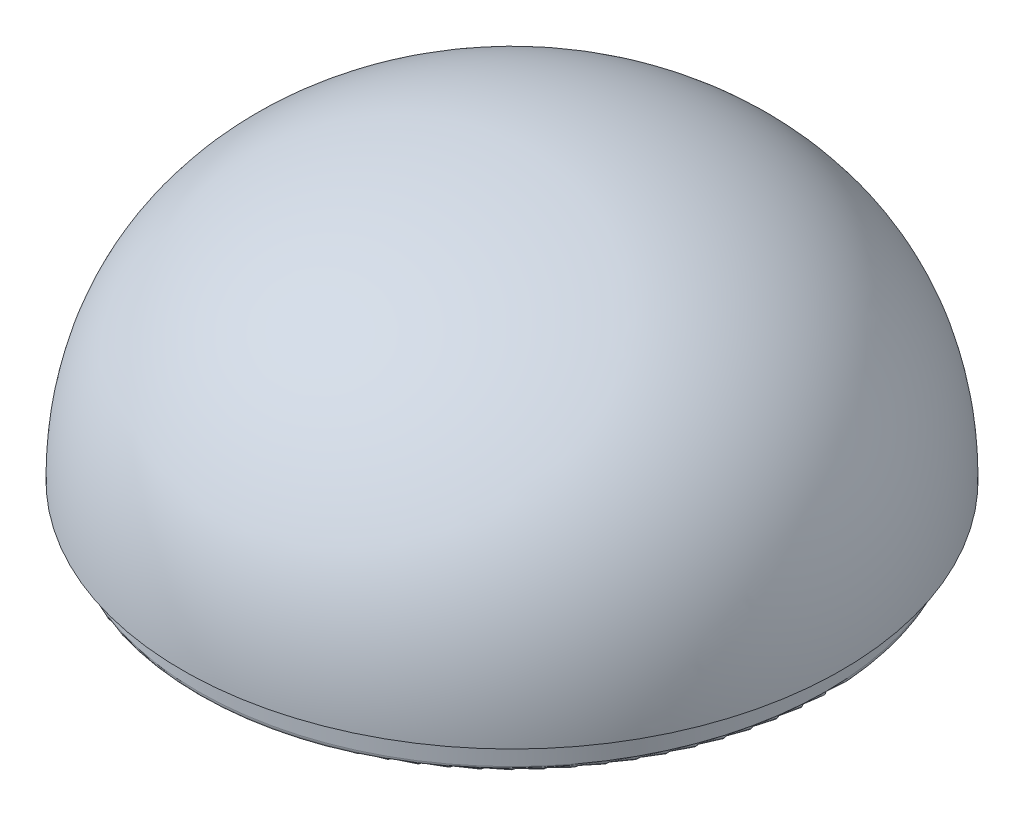
ISO-10303-21;
HEADER;
FILE_DESCRIPTION(('STEP AP214'),'2;1');
FILE_NAME('part.step','',(''),(''),'','','');
FILE_SCHEMA(('AUTOMOTIVE_DESIGN { 1 0 10303 214 1 1 1 1 }'));
ENDSEC;
DATA;
#1=APPLICATION_CONTEXT('core data for automotive mechanical design processes');
#2=APPLICATION_PROTOCOL_DEFINITION('international standard','automotive_design',2000,#1);
#3=PRODUCT_CONTEXT('',#1,'mechanical');
#4=PRODUCT('Part','Part','',(#3));
#5=PRODUCT_RELATED_PRODUCT_CATEGORY('part','',(#4));
#6=PRODUCT_DEFINITION_FORMATION('','',#4);
#7=PRODUCT_DEFINITION_CONTEXT('part definition',#1,'design');
#8=PRODUCT_DEFINITION('design','',#6,#7);
#9=PRODUCT_DEFINITION_SHAPE('','',#8);
#10=(LENGTH_UNIT() NAMED_UNIT(*) SI_UNIT(.MILLI.,.METRE.));
#11=(NAMED_UNIT(*) PLANE_ANGLE_UNIT() SI_UNIT($,.RADIAN.));
#12=(NAMED_UNIT(*) SI_UNIT($,.STERADIAN.) SOLID_ANGLE_UNIT());
#13=UNCERTAINTY_MEASURE_WITH_UNIT(LENGTH_MEASURE(1.E-05),#10,'distance_accuracy_value','');
#14=(GEOMETRIC_REPRESENTATION_CONTEXT(3) GLOBAL_UNCERTAINTY_ASSIGNED_CONTEXT((#13)) GLOBAL_UNIT_ASSIGNED_CONTEXT((#10,
#11,#12)) REPRESENTATION_CONTEXT('',''));
#15=CARTESIAN_POINT('',(0.,0.,0.));
#16=DIRECTION('',(0.,0.,1.));
#17=DIRECTION('',(1.,0.,0.));
#18=AXIS2_PLACEMENT_3D('',#15,#16,#17);
#19=CARTESIAN_POINT('',(0.,0.,0.));
#20=DIRECTION('',(0.,-1.,0.));
#21=DIRECTION('',(0.,0.,-1.));
#22=AXIS2_PLACEMENT_3D('',#19,#20,#21);
#23=CYLINDRICAL_SURFACE('',#22,29.7);
#24=CARTESIAN_POINT('',(0.,0.5,0.));
#25=DIRECTION('',(0.,1.,0.));
#26=DIRECTION('',(0.,0.,1.));
#27=AXIS2_PLACEMENT_3D('',#24,#25,#26);
#28=CIRCLE('',#27,29.7);
#29=CARTESIAN_POINT('',(0.,0.5,29.7));
#30=VERTEX_POINT('',#29);
#31=EDGE_CURVE('E11',#30,#30,#28,.T.);
#32=ORIENTED_EDGE('',*,*,#31,.T.);
#33=EDGE_LOOP('',(#32));
#34=FACE_BOUND('',#33,.T.);
#35=CARTESIAN_POINT('',(0.,3.,0.));
#36=DIRECTION('',(0.,-1.,0.));
#37=DIRECTION('',(0.,0.,-1.));
#38=AXIS2_PLACEMENT_3D('',#35,#36,#37);
#39=CIRCLE('',#38,29.7);
#40=CARTESIAN_POINT('',(0.,3.,-29.7));
#41=VERTEX_POINT('',#40);
#42=EDGE_CURVE('E63',#41,#41,#39,.T.);
#43=ORIENTED_EDGE('',*,*,#42,.T.);
#44=EDGE_LOOP('',(#43));
#45=FACE_BOUND('',#44,.T.);
#46=ADVANCED_FACE('F32',(#34,#45),#23,.T.);
#47=CARTESIAN_POINT('',(-29.7,0.,0.));
#48=DIRECTION('',(0.,1.,0.));
#49=DIRECTION('',(0.,0.,1.));
#50=AXIS2_PLACEMENT_3D('',#47,#48,#49);
#51=PLANE('',#50);
#52=CARTESIAN_POINT('',(0.,0.,0.));
#53=DIRECTION('',(0.,1.,0.));
#54=DIRECTION('',(0.,0.,1.));
#55=AXIS2_PLACEMENT_3D('',#52,#53,#54);
#56=CIRCLE('',#55,29.2);
#57=CARTESIAN_POINT('',(0.,0.,29.2));
#58=VERTEX_POINT('',#57);
#59=EDGE_CURVE('E40',#58,#58,#56,.F.);
#60=ORIENTED_EDGE('',*,*,#59,.T.);
#61=EDGE_LOOP('',(#60));
#62=FACE_BOUND('',#61,.T.);
#63=CARTESIAN_POINT('',(0.,0.,0.));
#64=DIRECTION('',(0.,-1.,0.));
#65=DIRECTION('',(0.,0.,-1.));
#66=AXIS2_PLACEMENT_3D('',#63,#64,#65);
#67=CIRCLE('',#66,28.7);
#68=CARTESIAN_POINT('',(0.,0.,-28.7));
#69=VERTEX_POINT('',#68);
#70=EDGE_CURVE('E69',#69,#69,#67,.T.);
#71=ORIENTED_EDGE('',*,*,#70,.F.);
#72=EDGE_LOOP('',(#71));
#73=FACE_BOUND('',#72,.T.);
#74=ADVANCED_FACE('F74',(#62,#73),#51,.F.);
#75=CARTESIAN_POINT('',(0.,0.,0.));
#76=DIRECTION('',(0.,-1.,0.));
#77=DIRECTION('',(0.,0.,-1.));
#78=AXIS2_PLACEMENT_3D('',#75,#76,#77);
#79=CYLINDRICAL_SURFACE('',#78,28.7);
#80=CARTESIAN_POINT('',(0.,3.,0.));
#81=DIRECTION('',(0.,-1.,0.));
#82=DIRECTION('',(0.,0.,-1.));
#83=AXIS2_PLACEMENT_3D('',#80,#81,#82);
#84=CIRCLE('',#83,28.7);
#85=CARTESIAN_POINT('',(0.,3.,-28.7));
#86=VERTEX_POINT('',#85);
#87=EDGE_CURVE('E60',#86,#86,#84,.T.);
#88=ORIENTED_EDGE('',*,*,#87,.F.);
#89=EDGE_LOOP('',(#88));
#90=FACE_BOUND('',#89,.T.);
#91=ORIENTED_EDGE('',*,*,#70,.T.);
#92=EDGE_LOOP('',(#91));
#93=FACE_BOUND('',#92,.T.);
#94=ADVANCED_FACE('F91',(#90,#93),#79,.F.);
#95=CARTESIAN_POINT('',(0.,3.,0.));
#96=DIRECTION('',(0.,1.,0.));
#97=DIRECTION('',(0.,0.,1.));
#98=AXIS2_PLACEMENT_3D('',#95,#96,#97);
#99=CONICAL_SURFACE('',#98,28.7,0.785398163397448);
#100=CARTESIAN_POINT('',(0.,4.,0.));
#101=DIRECTION('',(0.,-1.,0.));
#102=DIRECTION('',(0.,0.,-1.));
#103=AXIS2_PLACEMENT_3D('',#100,#101,#102);
#104=CIRCLE('',#103,29.7);
#105=CARTESIAN_POINT('',(0.,4.,-29.7));
#106=VERTEX_POINT('',#105);
#107=EDGE_CURVE('E56',#106,#106,#104,.T.);
#108=ORIENTED_EDGE('',*,*,#107,.F.);
#109=EDGE_LOOP('',(#108));
#110=FACE_BOUND('',#109,.T.);
#111=ORIENTED_EDGE('',*,*,#87,.T.);
#112=EDGE_LOOP('',(#111));
#113=FACE_BOUND('',#112,.T.);
#114=ADVANCED_FACE('F97',(#110,#113),#99,.F.);
#115=CARTESIAN_POINT('',(-29.7,4.,0.));
#116=DIRECTION('',(0.,-1.,0.));
#117=DIRECTION('',(0.,0.,-1.));
#118=AXIS2_PLACEMENT_3D('',#115,#116,#117);
#119=PLANE('',#118);
#120=CARTESIAN_POINT('',(0.,4.,0.));
#121=DIRECTION('',(0.,-1.,0.));
#122=DIRECTION('',(0.,0.,-1.));
#123=AXIS2_PLACEMENT_3D('',#120,#121,#122);
#124=CIRCLE('',#123,30.1840269038688);
#125=CARTESIAN_POINT('',(0.,4.,-30.1840269038688));
#126=VERTEX_POINT('',#125);
#127=EDGE_CURVE('E54',#126,#126,#124,.T.);
#128=ORIENTED_EDGE('',*,*,#127,.F.);
#129=EDGE_LOOP('',(#128));
#130=FACE_BOUND('',#129,.T.);
#131=ORIENTED_EDGE('',*,*,#107,.T.);
#132=EDGE_LOOP('',(#131));
#133=FACE_BOUND('',#132,.T.);
#134=ADVANCED_FACE('F50',(#130,#133),#119,.F.);
#135=CARTESIAN_POINT('',(-30.1840269038688,4.,0.));
#136=CARTESIAN_POINT('',(-30.1666234915999,4.54069605019566,0.));
#137=CARTESIAN_POINT('',(-30.1014861920097,5.63479172850266,0.));
#138=CARTESIAN_POINT('',(-29.8598707601921,7.70512250867275,0.));
#139=CARTESIAN_POINT('',(-29.3549559021287,10.1525480264449,0.));
#140=CARTESIAN_POINT('',(-28.4510097272693,12.8483109957507,0.));
#141=CARTESIAN_POINT('',(-26.880303632313,16.1410240796151,0.));
#142=CARTESIAN_POINT('',(-24.2888074556683,19.7079392021261,0.));
#143=CARTESIAN_POINT('',(-20.3466810809012,23.1586570864153,0.));
#144=CARTESIAN_POINT('',(-15.7484796690013,25.8053498537064,0.));
#145=CARTESIAN_POINT('',(-10.6894518056477,27.6666713108065,0.));
#146=CARTESIAN_POINT('',(-5.35344789253861,28.762877066065,0.));
#147=CARTESIAN_POINT('',(-1.78783699941001,29.,0.));
#148=CARTESIAN_POINT('',(0.,29.,0.));
#149=B_SPLINE_CURVE_WITH_KNOTS('',3,(#135,#136,#137,#138,#139,#140,#141,#142,#143,#144,#145,
#146,#147,#148),.UNSPECIFIED.,.F.,.F.,(4,1,1,1,1,1,1,1,1,1,1,4),(0.0183669474298204,
0.0490429803226385,0.0797190132154566,0.141071079001093,0.202423144786729,0.263775210572365,
0.386479342143638,0.50918347371491,0.631887605286183,0.754591736857455,0.877295868428728,1.),.UNSPECIFIED.);
#150=CARTESIAN_POINT('',(0.,0.,0.));
#151=DIRECTION('',(0.,-1.,0.));
#152=AXIS1_PLACEMENT('',#150,#151);
#153=SURFACE_OF_REVOLUTION('',#149,#152);
#154=CARTESIAN_POINT('',(0.,29.,0.));
#155=VERTEX_POINT('',#154);
#156=VERTEX_LOOP('',#155);
#157=FACE_BOUND('',#156,.T.);
#158=ORIENTED_EDGE('',*,*,#127,.T.);
#159=EDGE_LOOP('',(#158));
#160=FACE_BOUND('',#159,.T.);
#161=ADVANCED_FACE('F46',(#157,#160),#153,.T.);
#162=CARTESIAN_POINT('',(0.,30.,0.));
#163=CARTESIAN_POINT('',(-14.7951049571284,30.,0.));
#164=CARTESIAN_POINT('',(-31.2,21.9315981341569,0.));
#165=CARTESIAN_POINT('',(-31.2,3.,0.));
#166=B_SPLINE_CURVE_WITH_KNOTS('',3,(#162,#163,#164,#165),.UNSPECIFIED.,.F.,.F.,(4,4),(0.,1.),.UNSPECIFIED.);
#167=CARTESIAN_POINT('',(0.,0.,0.));
#168=DIRECTION('',(0.,-1.,0.));
#169=AXIS1_PLACEMENT('',#167,#168);
#170=SURFACE_OF_REVOLUTION('',#166,#169);
#171=CARTESIAN_POINT('',(0.,3.,0.));
#172=DIRECTION('',(0.,-1.,0.));
#173=DIRECTION('',(0.,0.,-1.));
#174=AXIS2_PLACEMENT_3D('',#171,#172,#173);
#175=CIRCLE('',#174,31.2);
#176=CARTESIAN_POINT('',(0.,3.,-31.2));
#177=VERTEX_POINT('',#176);
#178=EDGE_CURVE('E57',#177,#177,#175,.T.);
#179=ORIENTED_EDGE('',*,*,#178,.F.);
#180=EDGE_LOOP('',(#179));
#181=FACE_BOUND('',#180,.T.);
#182=CARTESIAN_POINT('',(0.,30.,0.));
#183=VERTEX_POINT('',#182);
#184=VERTEX_LOOP('',#183);
#185=FACE_BOUND('',#184,.T.);
#186=ADVANCED_FACE('F49',(#181,#185),#170,.T.);
#187=CARTESIAN_POINT('',(-29.7,3.,0.));
#188=DIRECTION('',(0.,1.,0.));
#189=DIRECTION('',(0.,0.,1.));
#190=AXIS2_PLACEMENT_3D('',#187,#188,#189);
#191=PLANE('',#190);
#192=ORIENTED_EDGE('',*,*,#42,.F.);
#193=EDGE_LOOP('',(#192));
#194=FACE_BOUND('',#193,.T.);
#195=ORIENTED_EDGE('',*,*,#178,.T.);
#196=EDGE_LOOP('',(#195));
#197=FACE_BOUND('',#196,.T.);
#198=ADVANCED_FACE('F78',(#194,#197),#191,.F.);
#199=CARTESIAN_POINT('',(0.,0.5,0.));
#200=DIRECTION('',(0.,1.,0.));
#201=DIRECTION('',(0.,0.,1.));
#202=AXIS2_PLACEMENT_3D('',#199,#200,#201);
#203=TOROIDAL_SURFACE('',#202,29.2,0.5);
#204=ORIENTED_EDGE('',*,*,#31,.F.);
#205=EDGE_LOOP('',(#204));
#206=FACE_BOUND('',#205,.T.);
#207=ORIENTED_EDGE('',*,*,#59,.F.);
#208=EDGE_LOOP('',(#207));
#209=FACE_BOUND('',#208,.T.);
#210=ADVANCED_FACE('F34',(#206,#209),#203,.T.);
#211=CLOSED_SHELL('',(#46,#74,#94,#114,#134,#161,#186,#198,#210));
#212=MANIFOLD_SOLID_BREP('B2',#211);
#213=ADVANCED_BREP_SHAPE_REPRESENTATION('',(#18,#212),#14);
#214=SHAPE_DEFINITION_REPRESENTATION(#9,#213);
ENDSEC;
END-ISO-10303-21;
